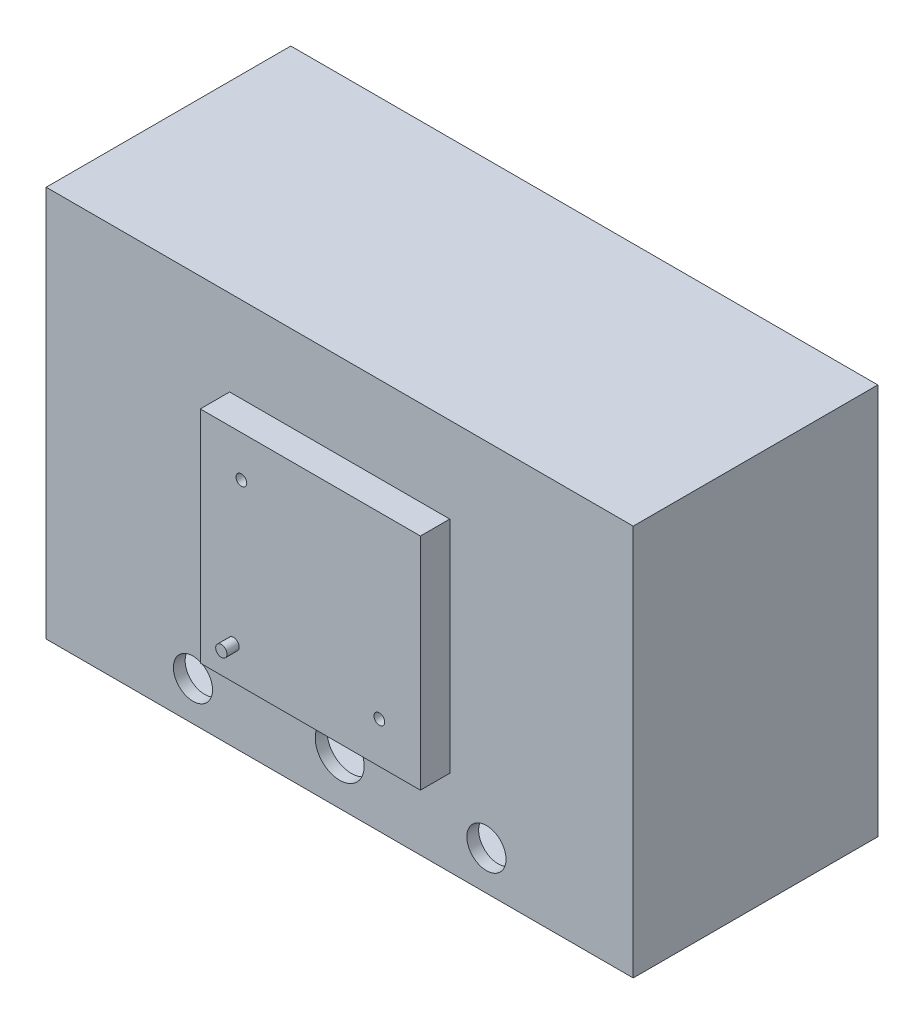
ISO-10303-21;
HEADER;
FILE_DESCRIPTION(('STEP AP214'),'2;1');
FILE_NAME('part.step','',(''),(''),'','','');
FILE_SCHEMA(('AUTOMOTIVE_DESIGN { 1 0 10303 214 1 1 1 1 }'));
ENDSEC;
DATA;
#1=APPLICATION_CONTEXT('core data for automotive mechanical design processes');
#2=APPLICATION_PROTOCOL_DEFINITION('international standard','automotive_design',2000,#1);
#3=PRODUCT_CONTEXT('',#1,'mechanical');
#4=PRODUCT('Part','Part','',(#3));
#5=PRODUCT_RELATED_PRODUCT_CATEGORY('part','',(#4));
#6=PRODUCT_DEFINITION_FORMATION('','',#4);
#7=PRODUCT_DEFINITION_CONTEXT('part definition',#1,'design');
#8=PRODUCT_DEFINITION('design','',#6,#7);
#9=PRODUCT_DEFINITION_SHAPE('','',#8);
#10=(LENGTH_UNIT() NAMED_UNIT(*) SI_UNIT(.MILLI.,.METRE.));
#11=(NAMED_UNIT(*) PLANE_ANGLE_UNIT() SI_UNIT($,.RADIAN.));
#12=(NAMED_UNIT(*) SI_UNIT($,.STERADIAN.) SOLID_ANGLE_UNIT());
#13=UNCERTAINTY_MEASURE_WITH_UNIT(LENGTH_MEASURE(1.E-05),#10,'distance_accuracy_value','');
#14=(GEOMETRIC_REPRESENTATION_CONTEXT(3) GLOBAL_UNCERTAINTY_ASSIGNED_CONTEXT((#13)) GLOBAL_UNIT_ASSIGNED_CONTEXT((#10,
#11,#12)) REPRESENTATION_CONTEXT('',''));
#15=CARTESIAN_POINT('',(0.,0.,0.));
#16=DIRECTION('',(0.,0.,1.));
#17=DIRECTION('',(1.,0.,0.));
#18=AXIS2_PLACEMENT_3D('',#15,#16,#17);
#19=CARTESIAN_POINT('',(0.,0.,50.));
#20=DIRECTION('',(0.,0.,-1.));
#21=DIRECTION('',(-1.,0.,0.));
#22=AXIS2_PLACEMENT_3D('',#19,#20,#21);
#23=PLANE('',#22);
#24=CARTESIAN_POINT('',(-30.,-32.,50.));
#25=DIRECTION('',(0.,0.,1.));
#26=DIRECTION('',(1.,0.,0.));
#27=AXIS2_PLACEMENT_3D('',#24,#25,#26);
#28=CIRCLE('',#27,4.);
#29=CARTESIAN_POINT('',(-26.,-32.,50.));
#30=VERTEX_POINT('',#29);
#31=EDGE_CURVE('E221',#30,#30,#28,.T.);
#32=ORIENTED_EDGE('',*,*,#31,.F.);
#33=EDGE_LOOP('',(#32));
#34=FACE_BOUND('',#33,.T.);
#35=CARTESIAN_POINT('',(30.,-32.,50.));
#36=DIRECTION('',(0.,0.,1.));
#37=DIRECTION('',(1.,0.,0.));
#38=AXIS2_PLACEMENT_3D('',#35,#36,#37);
#39=CIRCLE('',#38,4.00000000000001);
#40=CARTESIAN_POINT('',(34.,-32.,50.));
#41=VERTEX_POINT('',#40);
#42=EDGE_CURVE('E497',#41,#41,#39,.T.);
#43=ORIENTED_EDGE('',*,*,#42,.F.);
#44=EDGE_LOOP('',(#43));
#45=FACE_BOUND('',#44,.T.);
#46=CARTESIAN_POINT('',(0.,-30.,50.));
#47=DIRECTION('',(0.,0.,1.));
#48=DIRECTION('',(1.,0.,0.));
#49=AXIS2_PLACEMENT_3D('',#46,#47,#48);
#50=CIRCLE('',#49,5.);
#51=CARTESIAN_POINT('',(5.,-30.,50.));
#52=VERTEX_POINT('',#51);
#53=EDGE_CURVE('E244',#52,#52,#50,.T.);
#54=ORIENTED_EDGE('',*,*,#53,.F.);
#55=EDGE_LOOP('',(#54));
#56=FACE_BOUND('',#55,.T.);
#57=DIRECTION('',(0.,-1.,0.));
#58=VECTOR('',#57,1.);
#59=CARTESIAN_POINT('',(-60.,-40.,50.));
#60=LINE('',#59,#58);
#61=CARTESIAN_POINT('',(-60.,40.,50.));
#62=VERTEX_POINT('',#61);
#63=CARTESIAN_POINT('',(-60.,-40.,50.));
#64=VERTEX_POINT('',#63);
#65=EDGE_CURVE('E147',#62,#64,#60,.T.);
#66=ORIENTED_EDGE('',*,*,#65,.T.);
#67=DIRECTION('',(1.,0.,0.));
#68=VECTOR('',#67,1.);
#69=CARTESIAN_POINT('',(-60.,-40.,50.));
#70=LINE('',#69,#68);
#71=CARTESIAN_POINT('',(60.,-40.,50.));
#72=VERTEX_POINT('',#71);
#73=EDGE_CURVE('E153',#64,#72,#70,.T.);
#74=ORIENTED_EDGE('',*,*,#73,.T.);
#75=DIRECTION('',(0.,1.,0.));
#76=VECTOR('',#75,1.);
#77=CARTESIAN_POINT('',(60.,-40.,50.));
#78=LINE('',#77,#76);
#79=CARTESIAN_POINT('',(60.,40.,50.));
#80=VERTEX_POINT('',#79);
#81=EDGE_CURVE('E161',#72,#80,#78,.T.);
#82=ORIENTED_EDGE('',*,*,#81,.T.);
#83=DIRECTION('',(-1.,0.,0.));
#84=VECTOR('',#83,1.);
#85=CARTESIAN_POINT('',(-60.,40.,50.));
#86=LINE('',#85,#84);
#87=EDGE_CURVE('E163',#80,#62,#86,.T.);
#88=ORIENTED_EDGE('',*,*,#87,.T.);
#89=EDGE_LOOP('',(#66,#74,#82,#88));
#90=FACE_BOUND('',#89,.T.);
#91=DIRECTION('',(0.,-1.,0.));
#92=VECTOR('',#91,1.);
#93=CARTESIAN_POINT('',(-22.5,-22.5,50.));
#94=LINE('',#93,#92);
#95=CARTESIAN_POINT('',(-22.5,22.5,50.));
#96=VERTEX_POINT('',#95);
#97=CARTESIAN_POINT('',(-22.5,-22.5,50.));
#98=VERTEX_POINT('',#97);
#99=EDGE_CURVE('E57',#96,#98,#94,.T.);
#100=ORIENTED_EDGE('',*,*,#99,.F.);
#101=DIRECTION('',(-1.,0.,0.));
#102=VECTOR('',#101,1.);
#103=CARTESIAN_POINT('',(-22.5,22.5,50.));
#104=LINE('',#103,#102);
#105=CARTESIAN_POINT('',(22.5,22.5,50.));
#106=VERTEX_POINT('',#105);
#107=EDGE_CURVE('E58',#106,#96,#104,.T.);
#108=ORIENTED_EDGE('',*,*,#107,.F.);
#109=DIRECTION('',(0.,1.,0.));
#110=VECTOR('',#109,1.);
#111=CARTESIAN_POINT('',(22.5,-22.5,50.));
#112=LINE('',#111,#110);
#113=CARTESIAN_POINT('',(22.5,-22.5,50.));
#114=VERTEX_POINT('',#113);
#115=EDGE_CURVE('E256',#114,#106,#112,.T.);
#116=ORIENTED_EDGE('',*,*,#115,.F.);
#117=DIRECTION('',(1.,0.,0.));
#118=VECTOR('',#117,1.);
#119=CARTESIAN_POINT('',(-22.5,-22.5,50.));
#120=LINE('',#119,#118);
#121=EDGE_CURVE('E258',#98,#114,#120,.T.);
#122=ORIENTED_EDGE('',*,*,#121,.F.);
#123=EDGE_LOOP('',(#100,#108,#116,#122));
#124=FACE_BOUND('',#123,.T.);
#125=ADVANCED_FACE('F39',(#34,#45,#56,#90,#124),#23,.F.);
#126=CARTESIAN_POINT('',(0.,0.,0.));
#127=DIRECTION('',(0.,0.,-1.));
#128=DIRECTION('',(-1.,0.,0.));
#129=AXIS2_PLACEMENT_3D('',#126,#127,#128);
#130=PLANE('',#129);
#131=DIRECTION('',(0.,-1.,0.));
#132=VECTOR('',#131,1.);
#133=CARTESIAN_POINT('',(-60.,-40.,0.));
#134=LINE('',#133,#132);
#135=CARTESIAN_POINT('',(-60.,40.,0.));
#136=VERTEX_POINT('',#135);
#137=CARTESIAN_POINT('',(-60.,-40.,0.));
#138=VERTEX_POINT('',#137);
#139=EDGE_CURVE('E203',#136,#138,#134,.T.);
#140=ORIENTED_EDGE('',*,*,#139,.F.);
#141=DIRECTION('',(-1.,0.,0.));
#142=VECTOR('',#141,1.);
#143=CARTESIAN_POINT('',(-60.,40.,0.));
#144=LINE('',#143,#142);
#145=CARTESIAN_POINT('',(60.,40.,0.));
#146=VERTEX_POINT('',#145);
#147=EDGE_CURVE('E208',#146,#136,#144,.T.);
#148=ORIENTED_EDGE('',*,*,#147,.F.);
#149=DIRECTION('',(0.,1.,0.));
#150=VECTOR('',#149,1.);
#151=CARTESIAN_POINT('',(60.,-40.,0.));
#152=LINE('',#151,#150);
#153=CARTESIAN_POINT('',(60.,-40.,0.));
#154=VERTEX_POINT('',#153);
#155=EDGE_CURVE('E206',#154,#146,#152,.T.);
#156=ORIENTED_EDGE('',*,*,#155,.F.);
#157=DIRECTION('',(1.,0.,0.));
#158=VECTOR('',#157,1.);
#159=CARTESIAN_POINT('',(-60.,-40.,0.));
#160=LINE('',#159,#158);
#161=EDGE_CURVE('E204',#138,#154,#160,.T.);
#162=ORIENTED_EDGE('',*,*,#161,.F.);
#163=EDGE_LOOP('',(#140,#148,#156,#162));
#164=FACE_BOUND('',#163,.T.);
#165=DIRECTION('',(-1.,0.,0.));
#166=VECTOR('',#165,1.);
#167=CARTESIAN_POINT('',(-57.6,37.6,0.));
#168=LINE('',#167,#166);
#169=CARTESIAN_POINT('',(57.6,37.6,0.));
#170=VERTEX_POINT('',#169);
#171=CARTESIAN_POINT('',(-57.6,37.6,0.));
#172=VERTEX_POINT('',#171);
#173=EDGE_CURVE('E171',#170,#172,#168,.T.);
#174=ORIENTED_EDGE('',*,*,#173,.T.);
#175=DIRECTION('',(0.,-1.,0.));
#176=VECTOR('',#175,1.);
#177=CARTESIAN_POINT('',(-57.6,-37.6,0.));
#178=LINE('',#177,#176);
#179=CARTESIAN_POINT('',(-57.6,-37.6,0.));
#180=VERTEX_POINT('',#179);
#181=EDGE_CURVE('E170',#172,#180,#178,.T.);
#182=ORIENTED_EDGE('',*,*,#181,.T.);
#183=DIRECTION('',(1.,0.,0.));
#184=VECTOR('',#183,1.);
#185=CARTESIAN_POINT('',(-57.6,-37.6,0.));
#186=LINE('',#185,#184);
#187=CARTESIAN_POINT('',(57.6,-37.6,0.));
#188=VERTEX_POINT('',#187);
#189=EDGE_CURVE('E184',#180,#188,#186,.T.);
#190=ORIENTED_EDGE('',*,*,#189,.T.);
#191=DIRECTION('',(0.,1.,0.));
#192=VECTOR('',#191,1.);
#193=CARTESIAN_POINT('',(57.6,-37.6,0.));
#194=LINE('',#193,#192);
#195=EDGE_CURVE('E186',#188,#170,#194,.T.);
#196=ORIENTED_EDGE('',*,*,#195,.T.);
#197=EDGE_LOOP('',(#174,#182,#190,#196));
#198=FACE_BOUND('',#197,.T.);
#199=ADVANCED_FACE('F268',(#164,#198),#130,.T.);
#200=CARTESIAN_POINT('',(-60.,-40.,47.6));
#201=DIRECTION('',(1.,0.,0.));
#202=DIRECTION('',(0.,0.,-1.));
#203=AXIS2_PLACEMENT_3D('',#200,#201,#202);
#204=PLANE('',#203);
#205=ORIENTED_EDGE('',*,*,#139,.T.);
#206=DIRECTION('',(0.,0.,-1.));
#207=VECTOR('',#206,1.);
#208=CARTESIAN_POINT('',(-60.,-40.,47.6));
#209=LINE('',#208,#207);
#210=EDGE_CURVE('E48',#64,#138,#209,.T.);
#211=ORIENTED_EDGE('',*,*,#210,.F.);
#212=ORIENTED_EDGE('',*,*,#65,.F.);
#213=DIRECTION('',(0.,0.,-1.));
#214=VECTOR('',#213,1.);
#215=CARTESIAN_POINT('',(-60.,40.,47.6));
#216=LINE('',#215,#214);
#217=EDGE_CURVE('E209',#62,#136,#216,.T.);
#218=ORIENTED_EDGE('',*,*,#217,.T.);
#219=EDGE_LOOP('',(#205,#211,#212,#218));
#220=FACE_BOUND('',#219,.T.);
#221=ADVANCED_FACE('F41',(#220),#204,.F.);
#222=CARTESIAN_POINT('',(-60.,-40.,47.6));
#223=DIRECTION('',(0.,1.,0.));
#224=DIRECTION('',(0.,0.,1.));
#225=AXIS2_PLACEMENT_3D('',#222,#223,#224);
#226=PLANE('',#225);
#227=ORIENTED_EDGE('',*,*,#161,.T.);
#228=DIRECTION('',(0.,0.,-1.));
#229=VECTOR('',#228,1.);
#230=CARTESIAN_POINT('',(60.,-40.,47.6));
#231=LINE('',#230,#229);
#232=EDGE_CURVE('E216',#72,#154,#231,.T.);
#233=ORIENTED_EDGE('',*,*,#232,.F.);
#234=ORIENTED_EDGE('',*,*,#73,.F.);
#235=ORIENTED_EDGE('',*,*,#210,.T.);
#236=EDGE_LOOP('',(#227,#233,#234,#235));
#237=FACE_BOUND('',#236,.T.);
#238=ADVANCED_FACE('F306',(#237),#226,.F.);
#239=CARTESIAN_POINT('',(60.,-40.,47.6));
#240=DIRECTION('',(-1.,0.,0.));
#241=DIRECTION('',(0.,0.,1.));
#242=AXIS2_PLACEMENT_3D('',#239,#240,#241);
#243=PLANE('',#242);
#244=ORIENTED_EDGE('',*,*,#155,.T.);
#245=DIRECTION('',(0.,0.,-1.));
#246=VECTOR('',#245,1.);
#247=CARTESIAN_POINT('',(60.,40.,47.6));
#248=LINE('',#247,#246);
#249=EDGE_CURVE('E213',#80,#146,#248,.T.);
#250=ORIENTED_EDGE('',*,*,#249,.F.);
#251=ORIENTED_EDGE('',*,*,#81,.F.);
#252=ORIENTED_EDGE('',*,*,#232,.T.);
#253=EDGE_LOOP('',(#244,#250,#251,#252));
#254=FACE_BOUND('',#253,.T.);
#255=ADVANCED_FACE('F304',(#254),#243,.F.);
#256=CARTESIAN_POINT('',(-60.,40.,47.6));
#257=DIRECTION('',(0.,-1.,0.));
#258=DIRECTION('',(0.,0.,-1.));
#259=AXIS2_PLACEMENT_3D('',#256,#257,#258);
#260=PLANE('',#259);
#261=ORIENTED_EDGE('',*,*,#147,.T.);
#262=ORIENTED_EDGE('',*,*,#217,.F.);
#263=ORIENTED_EDGE('',*,*,#87,.F.);
#264=ORIENTED_EDGE('',*,*,#249,.T.);
#265=EDGE_LOOP('',(#261,#262,#263,#264));
#266=FACE_BOUND('',#265,.T.);
#267=ADVANCED_FACE('F297',(#266),#260,.F.);
#268=CARTESIAN_POINT('',(-57.6,-37.6,47.6));
#269=DIRECTION('',(1.,0.,0.));
#270=DIRECTION('',(0.,0.,-1.));
#271=AXIS2_PLACEMENT_3D('',#268,#269,#270);
#272=PLANE('',#271);
#273=ORIENTED_EDGE('',*,*,#181,.F.);
#274=DIRECTION('',(0.,0.,-1.));
#275=VECTOR('',#274,1.);
#276=CARTESIAN_POINT('',(-57.6,37.6,47.6));
#277=LINE('',#276,#275);
#278=CARTESIAN_POINT('',(-57.6,37.6,47.6));
#279=VERTEX_POINT('',#278);
#280=EDGE_CURVE('E182',#279,#172,#277,.T.);
#281=ORIENTED_EDGE('',*,*,#280,.F.);
#282=DIRECTION('',(0.,-1.,0.));
#283=VECTOR('',#282,1.);
#284=CARTESIAN_POINT('',(-57.6,-37.6,47.6));
#285=LINE('',#284,#283);
#286=CARTESIAN_POINT('',(-57.6,-37.6,47.6));
#287=VERTEX_POINT('',#286);
#288=EDGE_CURVE('E169',#279,#287,#285,.T.);
#289=ORIENTED_EDGE('',*,*,#288,.T.);
#290=DIRECTION('',(0.,0.,-1.));
#291=VECTOR('',#290,1.);
#292=CARTESIAN_POINT('',(-57.6,-37.6,47.6));
#293=LINE('',#292,#291);
#294=EDGE_CURVE('E196',#287,#180,#293,.T.);
#295=ORIENTED_EDGE('',*,*,#294,.T.);
#296=EDGE_LOOP('',(#273,#281,#289,#295));
#297=FACE_BOUND('',#296,.T.);
#298=ADVANCED_FACE('F296',(#297),#272,.T.);
#299=CARTESIAN_POINT('',(-57.6,-37.6,47.6));
#300=DIRECTION('',(0.,1.,0.));
#301=DIRECTION('',(0.,0.,1.));
#302=AXIS2_PLACEMENT_3D('',#299,#300,#301);
#303=PLANE('',#302);
#304=ORIENTED_EDGE('',*,*,#189,.F.);
#305=ORIENTED_EDGE('',*,*,#294,.F.);
#306=DIRECTION('',(1.,0.,0.));
#307=VECTOR('',#306,1.);
#308=CARTESIAN_POINT('',(-57.6,-37.6,47.6));
#309=LINE('',#308,#307);
#310=CARTESIAN_POINT('',(57.6,-37.6,47.6));
#311=VERTEX_POINT('',#310);
#312=EDGE_CURVE('E174',#287,#311,#309,.T.);
#313=ORIENTED_EDGE('',*,*,#312,.T.);
#314=DIRECTION('',(0.,0.,-1.));
#315=VECTOR('',#314,1.);
#316=CARTESIAN_POINT('',(57.6,-37.6,47.6));
#317=LINE('',#316,#315);
#318=EDGE_CURVE('E198',#311,#188,#317,.T.);
#319=ORIENTED_EDGE('',*,*,#318,.T.);
#320=EDGE_LOOP('',(#304,#305,#313,#319));
#321=FACE_BOUND('',#320,.T.);
#322=ADVANCED_FACE('F291',(#321),#303,.T.);
#323=CARTESIAN_POINT('',(57.6,-37.6,47.6));
#324=DIRECTION('',(-1.,0.,0.));
#325=DIRECTION('',(0.,0.,1.));
#326=AXIS2_PLACEMENT_3D('',#323,#324,#325);
#327=PLANE('',#326);
#328=ORIENTED_EDGE('',*,*,#195,.F.);
#329=ORIENTED_EDGE('',*,*,#318,.F.);
#330=DIRECTION('',(0.,1.,0.));
#331=VECTOR('',#330,1.);
#332=CARTESIAN_POINT('',(57.6,-37.6,47.6));
#333=LINE('',#332,#331);
#334=CARTESIAN_POINT('',(57.6,37.6,47.6));
#335=VERTEX_POINT('',#334);
#336=EDGE_CURVE('E172',#311,#335,#333,.T.);
#337=ORIENTED_EDGE('',*,*,#336,.T.);
#338=DIRECTION('',(0.,0.,-1.));
#339=VECTOR('',#338,1.);
#340=CARTESIAN_POINT('',(57.6,37.6,47.6));
#341=LINE('',#340,#339);
#342=EDGE_CURVE('E193',#335,#170,#341,.T.);
#343=ORIENTED_EDGE('',*,*,#342,.T.);
#344=EDGE_LOOP('',(#328,#329,#337,#343));
#345=FACE_BOUND('',#344,.T.);
#346=ADVANCED_FACE('F288',(#345),#327,.T.);
#347=CARTESIAN_POINT('',(-57.6,37.6,47.6));
#348=DIRECTION('',(0.,-1.,0.));
#349=DIRECTION('',(0.,0.,-1.));
#350=AXIS2_PLACEMENT_3D('',#347,#348,#349);
#351=PLANE('',#350);
#352=ORIENTED_EDGE('',*,*,#173,.F.);
#353=ORIENTED_EDGE('',*,*,#342,.F.);
#354=DIRECTION('',(-1.,0.,0.));
#355=VECTOR('',#354,1.);
#356=CARTESIAN_POINT('',(-57.6,37.6,47.6));
#357=LINE('',#356,#355);
#358=EDGE_CURVE('E177',#335,#279,#357,.T.);
#359=ORIENTED_EDGE('',*,*,#358,.T.);
#360=ORIENTED_EDGE('',*,*,#280,.T.);
#361=EDGE_LOOP('',(#352,#353,#359,#360));
#362=FACE_BOUND('',#361,.T.);
#363=ADVANCED_FACE('F282',(#362),#351,.T.);
#364=CARTESIAN_POINT('',(0.,0.,47.6));
#365=DIRECTION('',(0.,0.,-1.));
#366=DIRECTION('',(-1.,0.,0.));
#367=AXIS2_PLACEMENT_3D('',#364,#365,#366);
#368=PLANE('',#367);
#369=CARTESIAN_POINT('',(-30.,-32.,47.6));
#370=DIRECTION('',(0.,0.,-1.));
#371=DIRECTION('',(-1.,0.,0.));
#372=AXIS2_PLACEMENT_3D('',#369,#370,#371);
#373=CIRCLE('',#372,4.);
#374=CARTESIAN_POINT('',(-34.,-32.,47.6));
#375=VERTEX_POINT('',#374);
#376=EDGE_CURVE('E43',#375,#375,#373,.T.);
#377=ORIENTED_EDGE('',*,*,#376,.F.);
#378=EDGE_LOOP('',(#377));
#379=FACE_BOUND('',#378,.T.);
#380=CARTESIAN_POINT('',(30.,-32.,47.6));
#381=DIRECTION('',(0.,0.,-1.));
#382=DIRECTION('',(-1.,0.,0.));
#383=AXIS2_PLACEMENT_3D('',#380,#381,#382);
#384=CIRCLE('',#383,4.00000000000001);
#385=CARTESIAN_POINT('',(26.,-32.,47.6));
#386=VERTEX_POINT('',#385);
#387=EDGE_CURVE('E224',#386,#386,#384,.T.);
#388=ORIENTED_EDGE('',*,*,#387,.F.);
#389=EDGE_LOOP('',(#388));
#390=FACE_BOUND('',#389,.T.);
#391=CARTESIAN_POINT('',(0.,-30.,47.6));
#392=DIRECTION('',(0.,0.,-1.));
#393=DIRECTION('',(-1.,0.,0.));
#394=AXIS2_PLACEMENT_3D('',#391,#392,#393);
#395=CIRCLE('',#394,5.);
#396=CARTESIAN_POINT('',(-5.,-30.,47.6));
#397=VERTEX_POINT('',#396);
#398=EDGE_CURVE('E222',#397,#397,#395,.T.);
#399=ORIENTED_EDGE('',*,*,#398,.F.);
#400=EDGE_LOOP('',(#399));
#401=FACE_BOUND('',#400,.T.);
#402=CARTESIAN_POINT('',(-14.1,14.1,47.6));
#403=DIRECTION('',(0.,0.,-1.));
#404=DIRECTION('',(-1.,0.,0.));
#405=AXIS2_PLACEMENT_3D('',#402,#403,#404);
#406=CIRCLE('',#405,1.1);
#407=CARTESIAN_POINT('',(-15.2,14.1,47.6));
#408=VERTEX_POINT('',#407);
#409=EDGE_CURVE('E248',#408,#408,#406,.T.);
#410=ORIENTED_EDGE('',*,*,#409,.F.);
#411=EDGE_LOOP('',(#410));
#412=FACE_BOUND('',#411,.T.);
#413=CARTESIAN_POINT('',(14.1,-14.1,47.6));
#414=DIRECTION('',(0.,0.,-1.));
#415=DIRECTION('',(-1.,0.,0.));
#416=AXIS2_PLACEMENT_3D('',#413,#414,#415);
#417=CIRCLE('',#416,1.1);
#418=CARTESIAN_POINT('',(13.,-14.1,47.6));
#419=VERTEX_POINT('',#418);
#420=EDGE_CURVE('E242',#419,#419,#417,.T.);
#421=ORIENTED_EDGE('',*,*,#420,.F.);
#422=EDGE_LOOP('',(#421));
#423=FACE_BOUND('',#422,.T.);
#424=ORIENTED_EDGE('',*,*,#288,.F.);
#425=ORIENTED_EDGE('',*,*,#358,.F.);
#426=ORIENTED_EDGE('',*,*,#336,.F.);
#427=ORIENTED_EDGE('',*,*,#312,.F.);
#428=EDGE_LOOP('',(#424,#425,#426,#427));
#429=FACE_BOUND('',#428,.T.);
#430=ADVANCED_FACE('F285',(#379,#390,#401,#412,#423,#429),#368,.T.);
#431=CARTESIAN_POINT('',(-22.5,-22.5,56.));
#432=DIRECTION('',(1.,0.,0.));
#433=DIRECTION('',(0.,0.,-1.));
#434=AXIS2_PLACEMENT_3D('',#431,#432,#433);
#435=PLANE('',#434);
#436=ORIENTED_EDGE('',*,*,#99,.T.);
#437=DIRECTION('',(0.,0.,-1.));
#438=VECTOR('',#437,1.);
#439=CARTESIAN_POINT('',(-22.5,-22.5,56.));
#440=LINE('',#439,#438);
#441=CARTESIAN_POINT('',(-22.5,-22.5,56.));
#442=VERTEX_POINT('',#441);
#443=EDGE_CURVE('E135',#442,#98,#440,.T.);
#444=ORIENTED_EDGE('',*,*,#443,.F.);
#445=DIRECTION('',(0.,-1.,0.));
#446=VECTOR('',#445,1.);
#447=CARTESIAN_POINT('',(-22.5,-22.5,56.));
#448=LINE('',#447,#446);
#449=CARTESIAN_POINT('',(-22.5,22.5,56.));
#450=VERTEX_POINT('',#449);
#451=EDGE_CURVE('E138',#450,#442,#448,.T.);
#452=ORIENTED_EDGE('',*,*,#451,.F.);
#453=DIRECTION('',(0.,0.,-1.));
#454=VECTOR('',#453,1.);
#455=CARTESIAN_POINT('',(-22.5,22.5,56.));
#456=LINE('',#455,#454);
#457=EDGE_CURVE('E255',#450,#96,#456,.T.);
#458=ORIENTED_EDGE('',*,*,#457,.T.);
#459=EDGE_LOOP('',(#436,#444,#452,#458));
#460=FACE_BOUND('',#459,.T.);
#461=ADVANCED_FACE('F149',(#460),#435,.F.);
#462=CARTESIAN_POINT('',(-22.5,-22.5,56.));
#463=DIRECTION('',(0.,1.,0.));
#464=DIRECTION('',(0.,0.,1.));
#465=AXIS2_PLACEMENT_3D('',#462,#463,#464);
#466=PLANE('',#465);
#467=ORIENTED_EDGE('',*,*,#121,.T.);
#468=DIRECTION('',(0.,0.,-1.));
#469=VECTOR('',#468,1.);
#470=CARTESIAN_POINT('',(22.5,-22.5,56.));
#471=LINE('',#470,#469);
#472=CARTESIAN_POINT('',(22.5,-22.5,56.));
#473=VERTEX_POINT('',#472);
#474=EDGE_CURVE('E132',#473,#114,#471,.T.);
#475=ORIENTED_EDGE('',*,*,#474,.F.);
#476=DIRECTION('',(1.,0.,0.));
#477=VECTOR('',#476,1.);
#478=CARTESIAN_POINT('',(-22.5,-22.5,56.));
#479=LINE('',#478,#477);
#480=EDGE_CURVE('E126',#442,#473,#479,.T.);
#481=ORIENTED_EDGE('',*,*,#480,.F.);
#482=ORIENTED_EDGE('',*,*,#443,.T.);
#483=EDGE_LOOP('',(#467,#475,#481,#482));
#484=FACE_BOUND('',#483,.T.);
#485=ADVANCED_FACE('F134',(#484),#466,.F.);
#486=CARTESIAN_POINT('',(22.5,-22.5,56.));
#487=DIRECTION('',(-1.,0.,0.));
#488=DIRECTION('',(0.,0.,1.));
#489=AXIS2_PLACEMENT_3D('',#486,#487,#488);
#490=PLANE('',#489);
#491=ORIENTED_EDGE('',*,*,#115,.T.);
#492=DIRECTION('',(0.,0.,-1.));
#493=VECTOR('',#492,1.);
#494=CARTESIAN_POINT('',(22.5,22.5,56.));
#495=LINE('',#494,#493);
#496=CARTESIAN_POINT('',(22.5,22.5,56.));
#497=VERTEX_POINT('',#496);
#498=EDGE_CURVE('E154',#497,#106,#495,.T.);
#499=ORIENTED_EDGE('',*,*,#498,.F.);
#500=DIRECTION('',(0.,1.,0.));
#501=VECTOR('',#500,1.);
#502=CARTESIAN_POINT('',(22.5,-22.5,56.));
#503=LINE('',#502,#501);
#504=EDGE_CURVE('E137',#473,#497,#503,.T.);
#505=ORIENTED_EDGE('',*,*,#504,.F.);
#506=ORIENTED_EDGE('',*,*,#474,.T.);
#507=EDGE_LOOP('',(#491,#499,#505,#506));
#508=FACE_BOUND('',#507,.T.);
#509=ADVANCED_FACE('F266',(#508),#490,.F.);
#510=CARTESIAN_POINT('',(-22.5,22.5,56.));
#511=DIRECTION('',(0.,-1.,0.));
#512=DIRECTION('',(0.,0.,-1.));
#513=AXIS2_PLACEMENT_3D('',#510,#511,#512);
#514=PLANE('',#513);
#515=ORIENTED_EDGE('',*,*,#107,.T.);
#516=ORIENTED_EDGE('',*,*,#457,.F.);
#517=DIRECTION('',(-1.,0.,0.));
#518=VECTOR('',#517,1.);
#519=CARTESIAN_POINT('',(-22.5,22.5,56.));
#520=LINE('',#519,#518);
#521=EDGE_CURVE('E145',#497,#450,#520,.T.);
#522=ORIENTED_EDGE('',*,*,#521,.F.);
#523=ORIENTED_EDGE('',*,*,#498,.T.);
#524=EDGE_LOOP('',(#515,#516,#522,#523));
#525=FACE_BOUND('',#524,.T.);
#526=ADVANCED_FACE('F262',(#525),#514,.F.);
#527=CARTESIAN_POINT('',(0.,0.,56.));
#528=DIRECTION('',(0.,0.,-1.));
#529=DIRECTION('',(-1.,0.,0.));
#530=AXIS2_PLACEMENT_3D('',#527,#528,#529);
#531=PLANE('',#530);
#532=CARTESIAN_POINT('',(-15.7,-15.7,56.));
#533=DIRECTION('',(0.,0.,1.));
#534=DIRECTION('',(1.,0.,0.));
#535=AXIS2_PLACEMENT_3D('',#532,#533,#534);
#536=CIRCLE('',#535,1.15);
#537=CARTESIAN_POINT('',(-14.55,-15.7,56.));
#538=VERTEX_POINT('',#537);
#539=EDGE_CURVE('E11',#538,#538,#536,.T.);
#540=ORIENTED_EDGE('',*,*,#539,.F.);
#541=EDGE_LOOP('',(#540));
#542=FACE_BOUND('',#541,.T.);
#543=CARTESIAN_POINT('',(-14.1,14.1,56.));
#544=DIRECTION('',(0.,0.,1.));
#545=DIRECTION('',(1.,0.,0.));
#546=AXIS2_PLACEMENT_3D('',#543,#544,#545);
#547=CIRCLE('',#546,1.1);
#548=CARTESIAN_POINT('',(-13.,14.1,56.));
#549=VERTEX_POINT('',#548);
#550=EDGE_CURVE('E236',#549,#549,#547,.T.);
#551=ORIENTED_EDGE('',*,*,#550,.F.);
#552=EDGE_LOOP('',(#551));
#553=FACE_BOUND('',#552,.T.);
#554=CARTESIAN_POINT('',(14.1,-14.1,56.));
#555=DIRECTION('',(0.,0.,1.));
#556=DIRECTION('',(1.,0.,0.));
#557=AXIS2_PLACEMENT_3D('',#554,#555,#556);
#558=CIRCLE('',#557,1.1);
#559=CARTESIAN_POINT('',(15.2,-14.1,56.));
#560=VERTEX_POINT('',#559);
#561=EDGE_CURVE('E232',#560,#560,#558,.T.);
#562=ORIENTED_EDGE('',*,*,#561,.F.);
#563=EDGE_LOOP('',(#562));
#564=FACE_BOUND('',#563,.T.);
#565=ORIENTED_EDGE('',*,*,#451,.T.);
#566=ORIENTED_EDGE('',*,*,#480,.T.);
#567=ORIENTED_EDGE('',*,*,#504,.T.);
#568=ORIENTED_EDGE('',*,*,#521,.T.);
#569=EDGE_LOOP('',(#565,#566,#567,#568));
#570=FACE_BOUND('',#569,.T.);
#571=ADVANCED_FACE('F142',(#542,#553,#564,#570),#531,.F.);
#572=CARTESIAN_POINT('',(14.1,-14.1,0.));
#573=DIRECTION('',(0.,0.,1.));
#574=DIRECTION('',(1.,0.,0.));
#575=AXIS2_PLACEMENT_3D('',#572,#573,#574);
#576=CYLINDRICAL_SURFACE('',#575,1.1);
#577=ORIENTED_EDGE('',*,*,#420,.T.);
#578=EDGE_LOOP('',(#577));
#579=FACE_BOUND('',#578,.T.);
#580=ORIENTED_EDGE('',*,*,#561,.T.);
#581=EDGE_LOOP('',(#580));
#582=FACE_BOUND('',#581,.T.);
#583=ADVANCED_FACE('F422',(#579,#582),#576,.F.);
#584=CARTESIAN_POINT('',(-14.1,14.1,0.));
#585=DIRECTION('',(0.,0.,1.));
#586=DIRECTION('',(1.,0.,0.));
#587=AXIS2_PLACEMENT_3D('',#584,#585,#586);
#588=CYLINDRICAL_SURFACE('',#587,1.1);
#589=ORIENTED_EDGE('',*,*,#409,.T.);
#590=EDGE_LOOP('',(#589));
#591=FACE_BOUND('',#590,.T.);
#592=ORIENTED_EDGE('',*,*,#550,.T.);
#593=EDGE_LOOP('',(#592));
#594=FACE_BOUND('',#593,.T.);
#595=ADVANCED_FACE('F427',(#591,#594),#588,.F.);
#596=CARTESIAN_POINT('',(-15.7,-15.7,58.5));
#597=DIRECTION('',(0.,0.,-1.));
#598=DIRECTION('',(-1.,0.,0.));
#599=AXIS2_PLACEMENT_3D('',#596,#597,#598);
#600=CYLINDRICAL_SURFACE('',#599,1.15);
#601=CARTESIAN_POINT('',(-15.7,-15.7,58.5));
#602=DIRECTION('',(0.,0.,1.));
#603=DIRECTION('',(1.,0.,0.));
#604=AXIS2_PLACEMENT_3D('',#601,#602,#603);
#605=CIRCLE('',#604,1.15);
#606=CARTESIAN_POINT('',(-14.55,-15.7,58.5));
#607=VERTEX_POINT('',#606);
#608=EDGE_CURVE('E228',#607,#607,#605,.T.);
#609=ORIENTED_EDGE('',*,*,#608,.F.);
#610=EDGE_LOOP('',(#609));
#611=FACE_BOUND('',#610,.T.);
#612=ORIENTED_EDGE('',*,*,#539,.T.);
#613=EDGE_LOOP('',(#612));
#614=FACE_BOUND('',#613,.T.);
#615=ADVANCED_FACE('F437',(#611,#614),#600,.T.);
#616=CARTESIAN_POINT('',(-15.7,-15.7,58.5));
#617=DIRECTION('',(0.,0.,1.));
#618=DIRECTION('',(1.,0.,0.));
#619=AXIS2_PLACEMENT_3D('',#616,#617,#618);
#620=PLANE('',#619);
#621=ORIENTED_EDGE('',*,*,#608,.T.);
#622=EDGE_LOOP('',(#621));
#623=FACE_BOUND('',#622,.T.);
#624=ADVANCED_FACE('F452',(#623),#620,.T.);
#625=CARTESIAN_POINT('',(0.,-30.,47.));
#626=DIRECTION('',(0.,0.,1.));
#627=DIRECTION('',(1.,0.,0.));
#628=AXIS2_PLACEMENT_3D('',#625,#626,#627);
#629=CYLINDRICAL_SURFACE('',#628,5.);
#630=ORIENTED_EDGE('',*,*,#398,.T.);
#631=EDGE_LOOP('',(#630));
#632=FACE_BOUND('',#631,.T.);
#633=ORIENTED_EDGE('',*,*,#53,.T.);
#634=EDGE_LOOP('',(#633));
#635=FACE_BOUND('',#634,.T.);
#636=ADVANCED_FACE('F464',(#632,#635),#629,.F.);
#637=CARTESIAN_POINT('',(30.,-32.,47.));
#638=DIRECTION('',(0.,0.,1.));
#639=DIRECTION('',(1.,0.,0.));
#640=AXIS2_PLACEMENT_3D('',#637,#638,#639);
#641=CYLINDRICAL_SURFACE('',#640,4.00000000000001);
#642=ORIENTED_EDGE('',*,*,#387,.T.);
#643=EDGE_LOOP('',(#642));
#644=FACE_BOUND('',#643,.T.);
#645=ORIENTED_EDGE('',*,*,#42,.T.);
#646=EDGE_LOOP('',(#645));
#647=FACE_BOUND('',#646,.T.);
#648=ADVANCED_FACE('F471',(#644,#647),#641,.F.);
#649=CARTESIAN_POINT('',(-30.,-32.,47.));
#650=DIRECTION('',(0.,0.,1.));
#651=DIRECTION('',(1.,0.,0.));
#652=AXIS2_PLACEMENT_3D('',#649,#650,#651);
#653=CYLINDRICAL_SURFACE('',#652,4.);
#654=ORIENTED_EDGE('',*,*,#376,.T.);
#655=EDGE_LOOP('',(#654));
#656=FACE_BOUND('',#655,.T.);
#657=ORIENTED_EDGE('',*,*,#31,.T.);
#658=EDGE_LOOP('',(#657));
#659=FACE_BOUND('',#658,.T.);
#660=ADVANCED_FACE('F483',(#656,#659),#653,.F.);
#661=CLOSED_SHELL('',(#125,#199,#221,#238,#255,#267,#298,#322,#346,#363,#430,#461,#485,#509,
#526,#571,#583,#595,#615,#624,#636,#648,#660));
#662=MANIFOLD_SOLID_BREP('B2',#661);
#663=ADVANCED_BREP_SHAPE_REPRESENTATION('',(#18,#662),#14);
#664=SHAPE_DEFINITION_REPRESENTATION(#9,#663);
ENDSEC;
END-ISO-10303-21;
